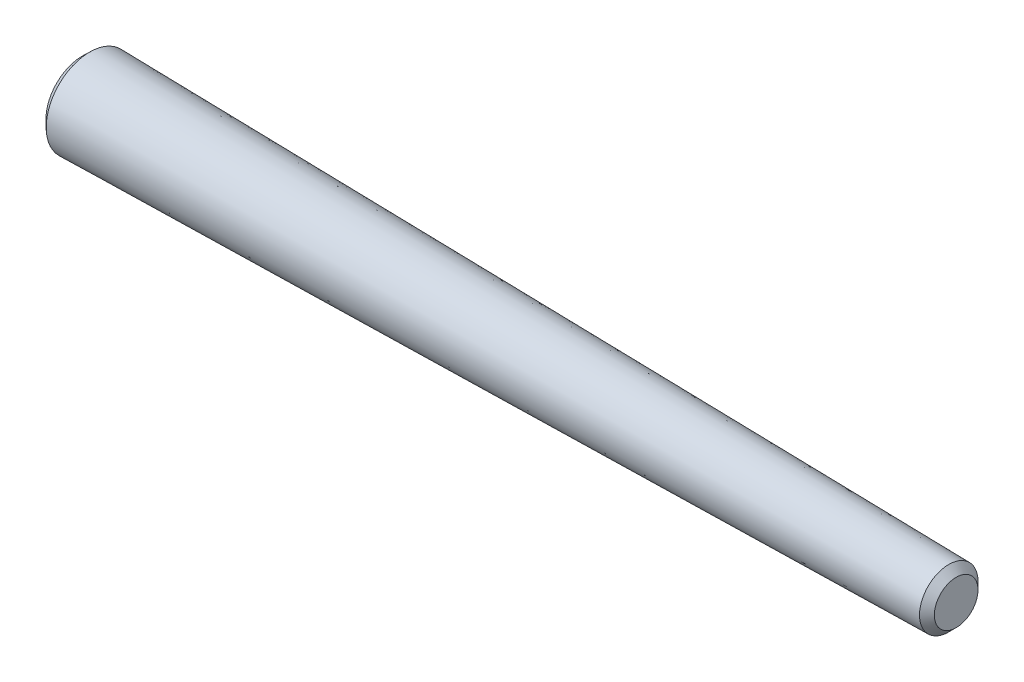
ISO-10303-21;
HEADER;
FILE_DESCRIPTION(('STEP AP214'),'2;1');
FILE_NAME('part.step','',(''),(''),'','','');
FILE_SCHEMA(('AUTOMOTIVE_DESIGN { 1 0 10303 214 1 1 1 1 }'));
ENDSEC;
DATA;
#1=APPLICATION_CONTEXT('core data for automotive mechanical design processes');
#2=APPLICATION_PROTOCOL_DEFINITION('international standard','automotive_design',2000,#1);
#3=PRODUCT_CONTEXT('',#1,'mechanical');
#4=PRODUCT('Part','Part','',(#3));
#5=PRODUCT_RELATED_PRODUCT_CATEGORY('part','',(#4));
#6=PRODUCT_DEFINITION_FORMATION('','',#4);
#7=PRODUCT_DEFINITION_CONTEXT('part definition',#1,'design');
#8=PRODUCT_DEFINITION('design','',#6,#7);
#9=PRODUCT_DEFINITION_SHAPE('','',#8);
#10=(LENGTH_UNIT() NAMED_UNIT(*) SI_UNIT(.MILLI.,.METRE.));
#11=(NAMED_UNIT(*) PLANE_ANGLE_UNIT() SI_UNIT($,.RADIAN.));
#12=(NAMED_UNIT(*) SI_UNIT($,.STERADIAN.) SOLID_ANGLE_UNIT());
#13=UNCERTAINTY_MEASURE_WITH_UNIT(LENGTH_MEASURE(1.E-05),#10,'distance_accuracy_value','');
#14=(GEOMETRIC_REPRESENTATION_CONTEXT(3) GLOBAL_UNCERTAINTY_ASSIGNED_CONTEXT((#13)) GLOBAL_UNIT_ASSIGNED_CONTEXT((#10,
#11,#12)) REPRESENTATION_CONTEXT('',''));
#15=CARTESIAN_POINT('',(0.,0.,0.));
#16=DIRECTION('',(0.,0.,1.));
#17=DIRECTION('',(1.,0.,0.));
#18=AXIS2_PLACEMENT_3D('',#15,#16,#17);
#19=CARTESIAN_POINT('',(0.,0.,0.));
#20=DIRECTION('',(1.,0.,0.));
#21=DIRECTION('',(0.,0.,-1.));
#22=AXIS2_PLACEMENT_3D('',#19,#20,#21);
#23=PLANE('',#22);
#24=CARTESIAN_POINT('',(0.,0.,0.));
#25=DIRECTION('',(1.,0.,0.));
#26=DIRECTION('',(0.,0.,-1.));
#27=AXIS2_PLACEMENT_3D('',#24,#25,#26);
#28=CIRCLE('',#27,2.50812842004315);
#29=CARTESIAN_POINT('',(0.,0.,-2.50812842004315));
#30=VERTEX_POINT('',#29);
#31=EDGE_CURVE('E10',#30,#30,#28,.F.);
#32=ORIENTED_EDGE('',*,*,#31,.T.);
#33=EDGE_LOOP('',(#32));
#34=FACE_BOUND('',#33,.T.);
#35=ADVANCED_FACE('F39',(#34),#23,.F.);
#36=CARTESIAN_POINT('',(60.,0.,0.));
#37=DIRECTION('',(-1.,0.,0.));
#38=DIRECTION('',(0.,0.,1.));
#39=AXIS2_PLACEMENT_3D('',#36,#37,#38);
#40=CONICAL_SURFACE('',#39,2.,0.0166651237139407);
#41=CARTESIAN_POINT('',(59.4915254237288,0.,0.));
#42=DIRECTION('',(1.,0.,0.));
#43=DIRECTION('',(0.,0.,-1.));
#44=AXIS2_PLACEMENT_3D('',#41,#42,#43);
#45=CIRCLE('',#44,2.00847457627119);
#46=CARTESIAN_POINT('',(59.4915254237288,0.,-2.00847457627119));
#47=VERTEX_POINT('',#46);
#48=EDGE_CURVE('E51',#47,#47,#45,.F.);
#49=ORIENTED_EDGE('',*,*,#48,.T.);
#50=EDGE_LOOP('',(#49));
#51=FACE_BOUND('',#50,.T.);
#52=CARTESIAN_POINT('',(0.499930570019985,0.,0.));
#53=DIRECTION('',(1.,0.,0.));
#54=DIRECTION('',(0.,0.,-1.));
#55=AXIS2_PLACEMENT_3D('',#52,#53,#54);
#56=CIRCLE('',#55,2.991667823833);
#57=CARTESIAN_POINT('',(0.499930570019985,0.,-2.991667823833));
#58=VERTEX_POINT('',#57);
#59=EDGE_CURVE('E55',#58,#58,#56,.T.);
#60=ORIENTED_EDGE('',*,*,#59,.T.);
#61=EDGE_LOOP('',(#60));
#62=FACE_BOUND('',#61,.T.);
#63=ADVANCED_FACE('F61',(#51,#62),#40,.T.);
#64=CARTESIAN_POINT('',(60.,2.,0.));
#65=DIRECTION('',(-1.,0.,0.));
#66=DIRECTION('',(0.,0.,1.));
#67=AXIS2_PLACEMENT_3D('',#64,#65,#66);
#68=PLANE('',#67);
#69=CARTESIAN_POINT('',(60.,0.,0.));
#70=DIRECTION('',(-1.,0.,0.));
#71=DIRECTION('',(0.,0.,1.));
#72=AXIS2_PLACEMENT_3D('',#69,#70,#71);
#73=CIRCLE('',#72,1.49999999999999);
#74=CARTESIAN_POINT('',(60.,0.,1.49999999999999));
#75=VERTEX_POINT('',#74);
#76=EDGE_CURVE('E47',#75,#75,#73,.F.);
#77=ORIENTED_EDGE('',*,*,#76,.T.);
#78=EDGE_LOOP('',(#77));
#79=FACE_BOUND('',#78,.T.);
#80=ADVANCED_FACE('F69',(#79),#68,.F.);
#81=CARTESIAN_POINT('',(59.4915254237288,0.,0.));
#82=DIRECTION('',(-1.,0.,0.));
#83=DIRECTION('',(0.,0.,1.));
#84=AXIS2_PLACEMENT_3D('',#81,#82,#83);
#85=CONICAL_SURFACE('',#84,2.00847457627119,0.785398163397453);
#86=ORIENTED_EDGE('',*,*,#76,.F.);
#87=EDGE_LOOP('',(#86));
#88=FACE_BOUND('',#87,.T.);
#89=ORIENTED_EDGE('',*,*,#48,.F.);
#90=EDGE_LOOP('',(#89));
#91=FACE_BOUND('',#90,.T.);
#92=ADVANCED_FACE('F65',(#88,#91),#85,.T.);
#93=CARTESIAN_POINT('',(0.,0.,0.));
#94=DIRECTION('',(1.,0.,0.));
#95=DIRECTION('',(0.,0.,-1.));
#96=AXIS2_PLACEMENT_3D('',#93,#94,#95);
#97=CONICAL_SURFACE('',#96,2.50812842004315,0.768733039683513);
#98=ORIENTED_EDGE('',*,*,#59,.F.);
#99=EDGE_LOOP('',(#98));
#100=FACE_BOUND('',#99,.T.);
#101=ORIENTED_EDGE('',*,*,#31,.F.);
#102=EDGE_LOOP('',(#101));
#103=FACE_BOUND('',#102,.T.);
#104=ADVANCED_FACE('F42',(#100,#103),#97,.T.);
#105=CLOSED_SHELL('',(#35,#63,#80,#92,#104));
#106=MANIFOLD_SOLID_BREP('B2',#105);
#107=ADVANCED_BREP_SHAPE_REPRESENTATION('',(#18,#106),#14);
#108=SHAPE_DEFINITION_REPRESENTATION(#9,#107);
ENDSEC;
END-ISO-10303-21;
